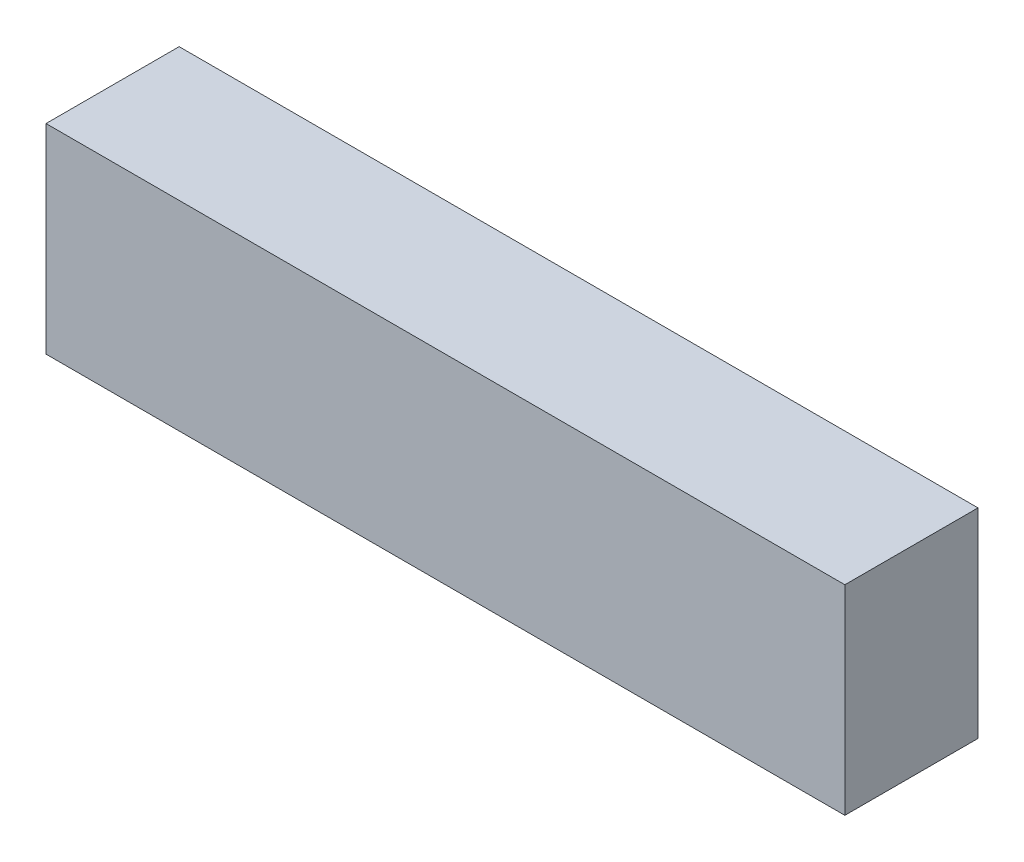
ISO-10303-21;
HEADER;
FILE_DESCRIPTION(('STEP AP214'),'2;1');
FILE_NAME('part.step','',(''),(''),'','','');
FILE_SCHEMA(('AUTOMOTIVE_DESIGN { 1 0 10303 214 1 1 1 1 }'));
ENDSEC;
DATA;
#1=APPLICATION_CONTEXT('core data for automotive mechanical design processes');
#2=APPLICATION_PROTOCOL_DEFINITION('international standard','automotive_design',2000,#1);
#3=PRODUCT_CONTEXT('',#1,'mechanical');
#4=PRODUCT('Part','Part','',(#3));
#5=PRODUCT_RELATED_PRODUCT_CATEGORY('part','',(#4));
#6=PRODUCT_DEFINITION_FORMATION('','',#4);
#7=PRODUCT_DEFINITION_CONTEXT('part definition',#1,'design');
#8=PRODUCT_DEFINITION('design','',#6,#7);
#9=PRODUCT_DEFINITION_SHAPE('','',#8);
#10=(LENGTH_UNIT() NAMED_UNIT(*) SI_UNIT(.MILLI.,.METRE.));
#11=(NAMED_UNIT(*) PLANE_ANGLE_UNIT() SI_UNIT($,.RADIAN.));
#12=(NAMED_UNIT(*) SI_UNIT($,.STERADIAN.) SOLID_ANGLE_UNIT());
#13=UNCERTAINTY_MEASURE_WITH_UNIT(LENGTH_MEASURE(1.E-05),#10,'distance_accuracy_value','');
#14=(GEOMETRIC_REPRESENTATION_CONTEXT(3) GLOBAL_UNCERTAINTY_ASSIGNED_CONTEXT((#13)) GLOBAL_UNIT_ASSIGNED_CONTEXT((#10,
#11,#12)) REPRESENTATION_CONTEXT('',''));
#15=CARTESIAN_POINT('',(0.,0.,0.));
#16=DIRECTION('',(0.,0.,1.));
#17=DIRECTION('',(1.,0.,0.));
#18=AXIS2_PLACEMENT_3D('',#15,#16,#17);
#19=CARTESIAN_POINT('',(152.4,38.1,50.8));
#20=DIRECTION('',(-1.,0.,0.));
#21=DIRECTION('',(0.,0.,1.));
#22=AXIS2_PLACEMENT_3D('',#19,#20,#21);
#23=PLANE('',#22);
#24=DIRECTION('',(0.,1.,0.));
#25=VECTOR('',#24,1.);
#26=CARTESIAN_POINT('',(152.4,38.1,0.));
#27=LINE('',#26,#25);
#28=CARTESIAN_POINT('',(152.4,-38.1,0.));
#29=VERTEX_POINT('',#28);
#30=CARTESIAN_POINT('',(152.4,38.1,0.));
#31=VERTEX_POINT('',#30);
#32=EDGE_CURVE('E96',#29,#31,#27,.T.);
#33=ORIENTED_EDGE('',*,*,#32,.T.);
#34=DIRECTION('',(0.,0.,-1.));
#35=VECTOR('',#34,1.);
#36=CARTESIAN_POINT('',(152.4,38.1,50.8));
#37=LINE('',#36,#35);
#38=CARTESIAN_POINT('',(152.4,38.1,50.8));
#39=VERTEX_POINT('',#38);
#40=EDGE_CURVE('E11',#39,#31,#37,.T.);
#41=ORIENTED_EDGE('',*,*,#40,.F.);
#42=DIRECTION('',(0.,1.,0.));
#43=VECTOR('',#42,1.);
#44=CARTESIAN_POINT('',(152.4,38.1,50.8));
#45=LINE('',#44,#43);
#46=CARTESIAN_POINT('',(152.4,-38.1,50.8));
#47=VERTEX_POINT('',#46);
#48=EDGE_CURVE('E84',#47,#39,#45,.T.);
#49=ORIENTED_EDGE('',*,*,#48,.F.);
#50=DIRECTION('',(0.,0.,-1.));
#51=VECTOR('',#50,1.);
#52=CARTESIAN_POINT('',(152.4,-38.1,50.8));
#53=LINE('',#52,#51);
#54=EDGE_CURVE('E92',#47,#29,#53,.T.);
#55=ORIENTED_EDGE('',*,*,#54,.T.);
#56=EDGE_LOOP('',(#33,#41,#49,#55));
#57=FACE_BOUND('',#56,.T.);
#58=ADVANCED_FACE('F33',(#57),#23,.F.);
#59=CARTESIAN_POINT('',(-152.4,38.1,50.8));
#60=DIRECTION('',(0.,-1.,0.));
#61=DIRECTION('',(0.,0.,-1.));
#62=AXIS2_PLACEMENT_3D('',#59,#60,#61);
#63=PLANE('',#62);
#64=DIRECTION('',(-1.,0.,0.));
#65=VECTOR('',#64,1.);
#66=CARTESIAN_POINT('',(-152.4,38.1,0.));
#67=LINE('',#66,#65);
#68=CARTESIAN_POINT('',(-152.4,38.1,0.));
#69=VERTEX_POINT('',#68);
#70=EDGE_CURVE('E88',#31,#69,#67,.T.);
#71=ORIENTED_EDGE('',*,*,#70,.T.);
#72=DIRECTION('',(0.,0.,-1.));
#73=VECTOR('',#72,1.);
#74=CARTESIAN_POINT('',(-152.4,38.1,50.8));
#75=LINE('',#74,#73);
#76=CARTESIAN_POINT('',(-152.4,38.1,50.8));
#77=VERTEX_POINT('',#76);
#78=EDGE_CURVE('E41',#77,#69,#75,.T.);
#79=ORIENTED_EDGE('',*,*,#78,.F.);
#80=DIRECTION('',(-1.,0.,0.));
#81=VECTOR('',#80,1.);
#82=CARTESIAN_POINT('',(-152.4,38.1,50.8));
#83=LINE('',#82,#81);
#84=EDGE_CURVE('E79',#39,#77,#83,.T.);
#85=ORIENTED_EDGE('',*,*,#84,.F.);
#86=ORIENTED_EDGE('',*,*,#40,.T.);
#87=EDGE_LOOP('',(#71,#79,#85,#86));
#88=FACE_BOUND('',#87,.T.);
#89=ADVANCED_FACE('F87',(#88),#63,.F.);
#90=CARTESIAN_POINT('',(-152.4,38.1,50.8));
#91=DIRECTION('',(1.,0.,0.));
#92=DIRECTION('',(0.,0.,-1.));
#93=AXIS2_PLACEMENT_3D('',#90,#91,#92);
#94=PLANE('',#93);
#95=DIRECTION('',(0.,-1.,0.));
#96=VECTOR('',#95,1.);
#97=CARTESIAN_POINT('',(-152.4,38.1,0.));
#98=LINE('',#97,#96);
#99=CARTESIAN_POINT('',(-152.4,-38.1,0.));
#100=VERTEX_POINT('',#99);
#101=EDGE_CURVE('E66',#69,#100,#98,.T.);
#102=ORIENTED_EDGE('',*,*,#101,.T.);
#103=DIRECTION('',(0.,0.,-1.));
#104=VECTOR('',#103,1.);
#105=CARTESIAN_POINT('',(-152.4,-38.1,50.8));
#106=LINE('',#105,#104);
#107=CARTESIAN_POINT('',(-152.4,-38.1,50.8));
#108=VERTEX_POINT('',#107);
#109=EDGE_CURVE('E89',#108,#100,#106,.T.);
#110=ORIENTED_EDGE('',*,*,#109,.F.);
#111=DIRECTION('',(0.,-1.,0.));
#112=VECTOR('',#111,1.);
#113=CARTESIAN_POINT('',(-152.4,38.1,50.8));
#114=LINE('',#113,#112);
#115=EDGE_CURVE('E82',#77,#108,#114,.T.);
#116=ORIENTED_EDGE('',*,*,#115,.F.);
#117=ORIENTED_EDGE('',*,*,#78,.T.);
#118=EDGE_LOOP('',(#102,#110,#116,#117));
#119=FACE_BOUND('',#118,.T.);
#120=ADVANCED_FACE('F90',(#119),#94,.F.);
#121=CARTESIAN_POINT('',(-152.4,-38.1,50.8));
#122=DIRECTION('',(0.,1.,0.));
#123=DIRECTION('',(0.,0.,1.));
#124=AXIS2_PLACEMENT_3D('',#121,#122,#123);
#125=PLANE('',#124);
#126=DIRECTION('',(1.,0.,0.));
#127=VECTOR('',#126,1.);
#128=CARTESIAN_POINT('',(-152.4,-38.1,0.));
#129=LINE('',#128,#127);
#130=EDGE_CURVE('E72',#100,#29,#129,.T.);
#131=ORIENTED_EDGE('',*,*,#130,.T.);
#132=ORIENTED_EDGE('',*,*,#54,.F.);
#133=DIRECTION('',(1.,0.,0.));
#134=VECTOR('',#133,1.);
#135=CARTESIAN_POINT('',(-152.4,-38.1,50.8));
#136=LINE('',#135,#134);
#137=EDGE_CURVE('E49',#108,#47,#136,.T.);
#138=ORIENTED_EDGE('',*,*,#137,.F.);
#139=ORIENTED_EDGE('',*,*,#109,.T.);
#140=EDGE_LOOP('',(#131,#132,#138,#139));
#141=FACE_BOUND('',#140,.T.);
#142=ADVANCED_FACE('F103',(#141),#125,.F.);
#143=CARTESIAN_POINT('',(0.,0.,50.8));
#144=DIRECTION('',(0.,0.,1.));
#145=DIRECTION('',(1.,0.,0.));
#146=AXIS2_PLACEMENT_3D('',#143,#144,#145);
#147=PLANE('',#146);
#148=ORIENTED_EDGE('',*,*,#48,.T.);
#149=ORIENTED_EDGE('',*,*,#84,.T.);
#150=ORIENTED_EDGE('',*,*,#115,.T.);
#151=ORIENTED_EDGE('',*,*,#137,.T.);
#152=EDGE_LOOP('',(#148,#149,#150,#151));
#153=FACE_BOUND('',#152,.T.);
#154=ADVANCED_FACE('F80',(#153),#147,.T.);
#155=CARTESIAN_POINT('',(0.,0.,0.));
#156=DIRECTION('',(0.,0.,1.));
#157=DIRECTION('',(1.,0.,0.));
#158=AXIS2_PLACEMENT_3D('',#155,#156,#157);
#159=PLANE('',#158);
#160=ORIENTED_EDGE('',*,*,#32,.F.);
#161=ORIENTED_EDGE('',*,*,#130,.F.);
#162=ORIENTED_EDGE('',*,*,#101,.F.);
#163=ORIENTED_EDGE('',*,*,#70,.F.);
#164=EDGE_LOOP('',(#160,#161,#162,#163));
#165=FACE_BOUND('',#164,.T.);
#166=ADVANCED_FACE('F106',(#165),#159,.F.);
#167=CLOSED_SHELL('',(#58,#89,#120,#142,#154,#166));
#168=MANIFOLD_SOLID_BREP('B2',#167);
#169=ADVANCED_BREP_SHAPE_REPRESENTATION('',(#18,#168),#14);
#170=SHAPE_DEFINITION_REPRESENTATION(#9,#169);
ENDSEC;
END-ISO-10303-21;
